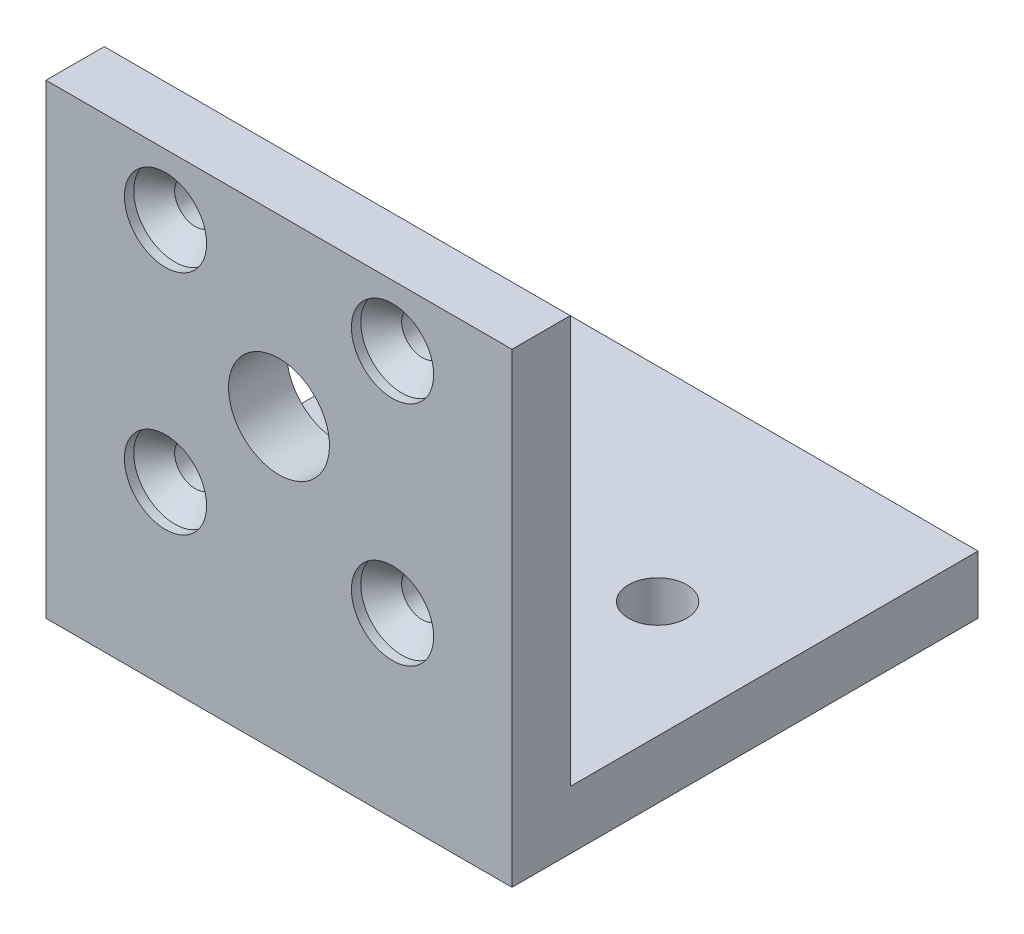
ISO-10303-21;
HEADER;
FILE_DESCRIPTION(('STEP AP214'),'2;1');
FILE_NAME('part.step','',(''),(''),'','','');
FILE_SCHEMA(('AUTOMOTIVE_DESIGN { 1 0 10303 214 1 1 1 1 }'));
ENDSEC;
DATA;
#1=APPLICATION_CONTEXT('core data for automotive mechanical design processes');
#2=APPLICATION_PROTOCOL_DEFINITION('international standard','automotive_design',2000,#1);
#3=PRODUCT_CONTEXT('',#1,'mechanical');
#4=PRODUCT('Part','Part','',(#3));
#5=PRODUCT_RELATED_PRODUCT_CATEGORY('part','',(#4));
#6=PRODUCT_DEFINITION_FORMATION('','',#4);
#7=PRODUCT_DEFINITION_CONTEXT('part definition',#1,'design');
#8=PRODUCT_DEFINITION('design','',#6,#7);
#9=PRODUCT_DEFINITION_SHAPE('','',#8);
#10=(LENGTH_UNIT() NAMED_UNIT(*) SI_UNIT(.MILLI.,.METRE.));
#11=(NAMED_UNIT(*) PLANE_ANGLE_UNIT() SI_UNIT($,.RADIAN.));
#12=(NAMED_UNIT(*) SI_UNIT($,.STERADIAN.) SOLID_ANGLE_UNIT());
#13=UNCERTAINTY_MEASURE_WITH_UNIT(LENGTH_MEASURE(1.E-05),#10,'distance_accuracy_value','');
#14=(GEOMETRIC_REPRESENTATION_CONTEXT(3) GLOBAL_UNCERTAINTY_ASSIGNED_CONTEXT((#13)) GLOBAL_UNIT_ASSIGNED_CONTEXT((#10,
#11,#12)) REPRESENTATION_CONTEXT('',''));
#15=CARTESIAN_POINT('',(0.,0.,0.));
#16=DIRECTION('',(0.,0.,1.));
#17=DIRECTION('',(1.,0.,0.));
#18=AXIS2_PLACEMENT_3D('',#15,#16,#17);
#19=CARTESIAN_POINT('',(50.8,0.,6.35));
#20=DIRECTION('',(0.,-1.,0.));
#21=DIRECTION('',(0.,0.,-1.));
#22=AXIS2_PLACEMENT_3D('',#19,#20,#21);
#23=PLANE('',#22);
#24=DIRECTION('',(0.,0.,1.));
#25=VECTOR('',#24,1.);
#26=CARTESIAN_POINT('',(0.,0.,6.35));
#27=LINE('',#26,#25);
#28=CARTESIAN_POINT('',(0.,0.,0.));
#29=VERTEX_POINT('',#28);
#30=CARTESIAN_POINT('',(0.,0.,6.35));
#31=VERTEX_POINT('',#30);
#32=EDGE_CURVE('E119',#29,#31,#27,.T.);
#33=ORIENTED_EDGE('',*,*,#32,.T.);
#34=DIRECTION('',(-1.,0.,0.));
#35=VECTOR('',#34,1.);
#36=CARTESIAN_POINT('',(50.8,0.,6.35));
#37=LINE('',#36,#35);
#38=CARTESIAN_POINT('',(50.8,0.,6.35));
#39=VERTEX_POINT('',#38);
#40=EDGE_CURVE('E11',#39,#31,#37,.T.);
#41=ORIENTED_EDGE('',*,*,#40,.F.);
#42=DIRECTION('',(0.,0.,1.));
#43=VECTOR('',#42,1.);
#44=CARTESIAN_POINT('',(50.8,0.,6.35));
#45=LINE('',#44,#43);
#46=CARTESIAN_POINT('',(50.8,0.,0.));
#47=VERTEX_POINT('',#46);
#48=EDGE_CURVE('E130',#47,#39,#45,.T.);
#49=ORIENTED_EDGE('',*,*,#48,.F.);
#50=DIRECTION('',(-1.,0.,0.));
#51=VECTOR('',#50,1.);
#52=CARTESIAN_POINT('',(50.8,0.,0.));
#53=LINE('',#52,#51);
#54=EDGE_CURVE('E115',#47,#29,#53,.T.);
#55=ORIENTED_EDGE('',*,*,#54,.T.);
#56=EDGE_LOOP('',(#33,#41,#49,#55));
#57=FACE_BOUND('',#56,.T.);
#58=ADVANCED_FACE('F33',(#57),#23,.F.);
#59=CARTESIAN_POINT('',(50.8,0.,6.35));
#60=DIRECTION('',(0.,0.,-1.));
#61=DIRECTION('',(0.,1.,0.));
#62=AXIS2_PLACEMENT_3D('',#59,#60,#61);
#63=PLANE('',#62);
#64=CARTESIAN_POINT('',(13.0256313292355,-6.67563132923533,6.35));
#65=DIRECTION('',(0.,0.,1.));
#66=DIRECTION('',(1.,0.,0.));
#67=AXIS2_PLACEMENT_3D('',#64,#65,#66);
#68=CIRCLE('',#67,4.48);
#69=CARTESIAN_POINT('',(17.5056313292355,-6.67563132923533,6.35));
#70=VERTEX_POINT('',#69);
#71=EDGE_CURVE('E427',#70,#70,#68,.T.);
#72=ORIENTED_EDGE('',*,*,#71,.F.);
#73=EDGE_LOOP('',(#72));
#74=FACE_BOUND('',#73,.T.);
#75=CARTESIAN_POINT('',(37.7743686707647,-6.6756313292355,6.35));
#76=DIRECTION('',(0.,0.,1.));
#77=DIRECTION('',(1.,0.,0.));
#78=AXIS2_PLACEMENT_3D('',#75,#76,#77);
#79=CIRCLE('',#78,4.48);
#80=CARTESIAN_POINT('',(42.2543686707647,-6.6756313292355,6.35));
#81=VERTEX_POINT('',#80);
#82=EDGE_CURVE('E154',#81,#81,#79,.T.);
#83=ORIENTED_EDGE('',*,*,#82,.F.);
#84=EDGE_LOOP('',(#83));
#85=FACE_BOUND('',#84,.T.);
#86=CARTESIAN_POINT('',(37.7743686707645,-31.4243686707647,6.35));
#87=DIRECTION('',(0.,0.,1.));
#88=DIRECTION('',(1.,0.,0.));
#89=AXIS2_PLACEMENT_3D('',#86,#87,#88);
#90=CIRCLE('',#89,4.48);
#91=CARTESIAN_POINT('',(42.2543686707645,-31.4243686707647,6.35));
#92=VERTEX_POINT('',#91);
#93=EDGE_CURVE('E147',#92,#92,#90,.T.);
#94=ORIENTED_EDGE('',*,*,#93,.F.);
#95=EDGE_LOOP('',(#94));
#96=FACE_BOUND('',#95,.T.);
#97=CARTESIAN_POINT('',(13.0256313292353,-31.4243686707645,6.35));
#98=DIRECTION('',(0.,0.,1.));
#99=DIRECTION('',(1.,0.,0.));
#100=AXIS2_PLACEMENT_3D('',#97,#98,#99);
#101=CIRCLE('',#100,4.48);
#102=CARTESIAN_POINT('',(17.5056313292353,-31.4243686707645,6.35));
#103=VERTEX_POINT('',#102);
#104=EDGE_CURVE('E143',#103,#103,#101,.T.);
#105=ORIENTED_EDGE('',*,*,#104,.F.);
#106=EDGE_LOOP('',(#105));
#107=FACE_BOUND('',#106,.T.);
#108=CARTESIAN_POINT('',(25.4,-19.05,6.35));
#109=DIRECTION('',(0.,0.,-1.));
#110=DIRECTION('',(0.,1.,0.));
#111=AXIS2_PLACEMENT_3D('',#108,#109,#110);
#112=CIRCLE('',#111,5.5);
#113=CARTESIAN_POINT('',(25.4,-13.55,6.35));
#114=VERTEX_POINT('',#113);
#115=EDGE_CURVE('E182',#114,#114,#112,.F.);
#116=ORIENTED_EDGE('',*,*,#115,.F.);
#117=EDGE_LOOP('',(#116));
#118=FACE_BOUND('',#117,.T.);
#119=DIRECTION('',(0.,-1.,0.));
#120=VECTOR('',#119,1.);
#121=CARTESIAN_POINT('',(0.,0.,6.35));
#122=LINE('',#121,#120);
#123=CARTESIAN_POINT('',(0.,-50.8,6.34999999999999));
#124=VERTEX_POINT('',#123);
#125=EDGE_CURVE('E122',#31,#124,#122,.T.);
#126=ORIENTED_EDGE('',*,*,#125,.T.);
#127=DIRECTION('',(-1.,0.,0.));
#128=VECTOR('',#127,1.);
#129=CARTESIAN_POINT('',(50.8,-50.8,6.34999999999999));
#130=LINE('',#129,#128);
#131=CARTESIAN_POINT('',(50.8,-50.8,6.34999999999999));
#132=VERTEX_POINT('',#131);
#133=EDGE_CURVE('E42',#132,#124,#130,.T.);
#134=ORIENTED_EDGE('',*,*,#133,.F.);
#135=DIRECTION('',(0.,-1.,0.));
#136=VECTOR('',#135,1.);
#137=CARTESIAN_POINT('',(50.8,0.,6.35));
#138=LINE('',#137,#136);
#139=EDGE_CURVE('E88',#39,#132,#138,.T.);
#140=ORIENTED_EDGE('',*,*,#139,.F.);
#141=ORIENTED_EDGE('',*,*,#40,.T.);
#142=EDGE_LOOP('',(#126,#134,#140,#141));
#143=FACE_BOUND('',#142,.T.);
#144=ADVANCED_FACE('F199',(#74,#85,#96,#107,#118,#143),#63,.F.);
#145=CARTESIAN_POINT('',(50.8,-50.8,6.34999999999999));
#146=DIRECTION('',(0.,1.,0.));
#147=DIRECTION('',(0.,0.,1.));
#148=AXIS2_PLACEMENT_3D('',#145,#146,#147);
#149=PLANE('',#148);
#150=CARTESIAN_POINT('',(38.1,-50.8,-22.225));
#151=DIRECTION('',(0.,1.,0.));
#152=DIRECTION('',(0.,0.,1.));
#153=AXIS2_PLACEMENT_3D('',#150,#151,#152);
#154=CIRCLE('',#153,3.175);
#155=CARTESIAN_POINT('',(38.1,-50.8,-19.05));
#156=VERTEX_POINT('',#155);
#157=EDGE_CURVE('E170',#156,#156,#154,.F.);
#158=ORIENTED_EDGE('',*,*,#157,.F.);
#159=EDGE_LOOP('',(#158));
#160=FACE_BOUND('',#159,.T.);
#161=CARTESIAN_POINT('',(12.7,-50.8,-22.225));
#162=DIRECTION('',(0.,1.,0.));
#163=DIRECTION('',(0.,0.,1.));
#164=AXIS2_PLACEMENT_3D('',#161,#162,#163);
#165=CIRCLE('',#164,3.175);
#166=CARTESIAN_POINT('',(12.7,-50.8,-19.05));
#167=VERTEX_POINT('',#166);
#168=EDGE_CURVE('E176',#167,#167,#165,.F.);
#169=ORIENTED_EDGE('',*,*,#168,.F.);
#170=EDGE_LOOP('',(#169));
#171=FACE_BOUND('',#170,.T.);
#172=DIRECTION('',(0.,0.,-1.));
#173=VECTOR('',#172,1.);
#174=CARTESIAN_POINT('',(0.,-50.8,6.34999999999999));
#175=LINE('',#174,#173);
#176=CARTESIAN_POINT('',(0.,-50.8,-44.45));
#177=VERTEX_POINT('',#176);
#178=EDGE_CURVE('E125',#124,#177,#175,.T.);
#179=ORIENTED_EDGE('',*,*,#178,.T.);
#180=DIRECTION('',(-1.,0.,0.));
#181=VECTOR('',#180,1.);
#182=CARTESIAN_POINT('',(50.8,-50.8,-44.45));
#183=LINE('',#182,#181);
#184=CARTESIAN_POINT('',(50.8,-50.8,-44.45));
#185=VERTEX_POINT('',#184);
#186=EDGE_CURVE('E110',#185,#177,#183,.T.);
#187=ORIENTED_EDGE('',*,*,#186,.F.);
#188=DIRECTION('',(0.,0.,-1.));
#189=VECTOR('',#188,1.);
#190=CARTESIAN_POINT('',(50.8,-50.8,6.34999999999999));
#191=LINE('',#190,#189);
#192=EDGE_CURVE('E101',#132,#185,#191,.T.);
#193=ORIENTED_EDGE('',*,*,#192,.F.);
#194=ORIENTED_EDGE('',*,*,#133,.T.);
#195=EDGE_LOOP('',(#179,#187,#193,#194));
#196=FACE_BOUND('',#195,.T.);
#197=ADVANCED_FACE('F202',(#160,#171,#196),#149,.F.);
#198=CARTESIAN_POINT('',(50.8,-44.45,-44.45));
#199=DIRECTION('',(0.,0.,1.));
#200=DIRECTION('',(1.,0.,0.));
#201=AXIS2_PLACEMENT_3D('',#198,#199,#200);
#202=PLANE('',#201);
#203=DIRECTION('',(0.,1.,0.));
#204=VECTOR('',#203,1.);
#205=CARTESIAN_POINT('',(0.,-44.45,-44.45));
#206=LINE('',#205,#204);
#207=CARTESIAN_POINT('',(0.,-44.45,-44.45));
#208=VERTEX_POINT('',#207);
#209=EDGE_CURVE('E109',#177,#208,#206,.T.);
#210=ORIENTED_EDGE('',*,*,#209,.T.);
#211=DIRECTION('',(-1.,0.,0.));
#212=VECTOR('',#211,1.);
#213=CARTESIAN_POINT('',(50.8,-44.45,-44.45));
#214=LINE('',#213,#212);
#215=CARTESIAN_POINT('',(50.8,-44.45,-44.45));
#216=VERTEX_POINT('',#215);
#217=EDGE_CURVE('E106',#216,#208,#214,.T.);
#218=ORIENTED_EDGE('',*,*,#217,.F.);
#219=DIRECTION('',(0.,1.,0.));
#220=VECTOR('',#219,1.);
#221=CARTESIAN_POINT('',(50.8,-44.45,-44.45));
#222=LINE('',#221,#220);
#223=EDGE_CURVE('E95',#185,#216,#222,.T.);
#224=ORIENTED_EDGE('',*,*,#223,.F.);
#225=ORIENTED_EDGE('',*,*,#186,.T.);
#226=EDGE_LOOP('',(#210,#218,#224,#225));
#227=FACE_BOUND('',#226,.T.);
#228=ADVANCED_FACE('F107',(#227),#202,.F.);
#229=CARTESIAN_POINT('',(50.8,-44.45,0.));
#230=DIRECTION('',(0.,-1.,0.));
#231=DIRECTION('',(0.,0.,-1.));
#232=AXIS2_PLACEMENT_3D('',#229,#230,#231);
#233=PLANE('',#232);
#234=CARTESIAN_POINT('',(38.1,-44.45,-22.225));
#235=DIRECTION('',(0.,1.,0.));
#236=DIRECTION('',(0.,0.,1.));
#237=AXIS2_PLACEMENT_3D('',#234,#235,#236);
#238=CIRCLE('',#237,3.175);
#239=CARTESIAN_POINT('',(38.1,-44.45,-19.05));
#240=VERTEX_POINT('',#239);
#241=EDGE_CURVE('E139',#240,#240,#238,.T.);
#242=ORIENTED_EDGE('',*,*,#241,.F.);
#243=EDGE_LOOP('',(#242));
#244=FACE_BOUND('',#243,.T.);
#245=CARTESIAN_POINT('',(12.7,-44.45,-22.225));
#246=DIRECTION('',(0.,1.,0.));
#247=DIRECTION('',(0.,0.,1.));
#248=AXIS2_PLACEMENT_3D('',#245,#246,#247);
#249=CIRCLE('',#248,3.175);
#250=CARTESIAN_POINT('',(12.7,-44.45,-19.05));
#251=VERTEX_POINT('',#250);
#252=EDGE_CURVE('E173',#251,#251,#249,.T.);
#253=ORIENTED_EDGE('',*,*,#252,.F.);
#254=EDGE_LOOP('',(#253));
#255=FACE_BOUND('',#254,.T.);
#256=DIRECTION('',(0.,0.,1.));
#257=VECTOR('',#256,1.);
#258=CARTESIAN_POINT('',(0.,-44.45,0.));
#259=LINE('',#258,#257);
#260=CARTESIAN_POINT('',(0.,-44.45,0.));
#261=VERTEX_POINT('',#260);
#262=EDGE_CURVE('E74',#208,#261,#259,.T.);
#263=ORIENTED_EDGE('',*,*,#262,.T.);
#264=DIRECTION('',(-1.,0.,0.));
#265=VECTOR('',#264,1.);
#266=CARTESIAN_POINT('',(50.8,-44.45,0.));
#267=LINE('',#266,#265);
#268=CARTESIAN_POINT('',(50.8,-44.45,0.));
#269=VERTEX_POINT('',#268);
#270=EDGE_CURVE('E111',#269,#261,#267,.T.);
#271=ORIENTED_EDGE('',*,*,#270,.F.);
#272=DIRECTION('',(0.,0.,1.));
#273=VECTOR('',#272,1.);
#274=CARTESIAN_POINT('',(50.8,-44.45,0.));
#275=LINE('',#274,#273);
#276=EDGE_CURVE('E99',#216,#269,#275,.T.);
#277=ORIENTED_EDGE('',*,*,#276,.F.);
#278=ORIENTED_EDGE('',*,*,#217,.T.);
#279=EDGE_LOOP('',(#263,#271,#277,#278));
#280=FACE_BOUND('',#279,.T.);
#281=ADVANCED_FACE('F113',(#244,#255,#280),#233,.F.);
#282=CARTESIAN_POINT('',(50.8,0.,0.));
#283=DIRECTION('',(0.,0.,1.));
#284=DIRECTION('',(0.,-1.,0.));
#285=AXIS2_PLACEMENT_3D('',#282,#283,#284);
#286=PLANE('',#285);
#287=CARTESIAN_POINT('',(25.4,-19.05,0.));
#288=DIRECTION('',(0.,0.,-1.));
#289=DIRECTION('',(0.,1.,0.));
#290=AXIS2_PLACEMENT_3D('',#287,#288,#289);
#291=CIRCLE('',#290,5.5);
#292=CARTESIAN_POINT('',(25.4,-13.55,0.));
#293=VERTEX_POINT('',#292);
#294=EDGE_CURVE('E179',#293,#293,#291,.T.);
#295=ORIENTED_EDGE('',*,*,#294,.F.);
#296=EDGE_LOOP('',(#295));
#297=FACE_BOUND('',#296,.T.);
#298=CARTESIAN_POINT('',(37.7743686707647,-6.6756313292355,0.));
#299=DIRECTION('',(0.,0.,-1.));
#300=DIRECTION('',(0.,1.,0.));
#301=AXIS2_PLACEMENT_3D('',#298,#299,#300);
#302=CIRCLE('',#301,2.25);
#303=CARTESIAN_POINT('',(37.7743686707647,-4.4256313292355,0.));
#304=VERTEX_POINT('',#303);
#305=EDGE_CURVE('E185',#304,#304,#302,.T.);
#306=ORIENTED_EDGE('',*,*,#305,.F.);
#307=EDGE_LOOP('',(#306));
#308=FACE_BOUND('',#307,.T.);
#309=CARTESIAN_POINT('',(37.7743686707645,-31.4243686707647,0.));
#310=DIRECTION('',(0.,0.,-1.));
#311=DIRECTION('',(0.,1.,0.));
#312=AXIS2_PLACEMENT_3D('',#309,#310,#311);
#313=CIRCLE('',#312,2.25);
#314=CARTESIAN_POINT('',(37.7743686707645,-29.1743686707647,0.));
#315=VERTEX_POINT('',#314);
#316=EDGE_CURVE('E188',#315,#315,#313,.T.);
#317=ORIENTED_EDGE('',*,*,#316,.F.);
#318=EDGE_LOOP('',(#317));
#319=FACE_BOUND('',#318,.T.);
#320=CARTESIAN_POINT('',(13.0256313292353,-31.4243686707645,0.));
#321=DIRECTION('',(0.,0.,-1.));
#322=DIRECTION('',(0.,1.,0.));
#323=AXIS2_PLACEMENT_3D('',#320,#321,#322);
#324=CIRCLE('',#323,2.25);
#325=CARTESIAN_POINT('',(13.0256313292353,-29.1743686707645,0.));
#326=VERTEX_POINT('',#325);
#327=EDGE_CURVE('E191',#326,#326,#324,.T.);
#328=ORIENTED_EDGE('',*,*,#327,.F.);
#329=EDGE_LOOP('',(#328));
#330=FACE_BOUND('',#329,.T.);
#331=CARTESIAN_POINT('',(13.0256313292355,-6.67563132923532,0.));
#332=DIRECTION('',(0.,0.,-1.));
#333=DIRECTION('',(0.,1.,0.));
#334=AXIS2_PLACEMENT_3D('',#331,#332,#333);
#335=CIRCLE('',#334,2.25);
#336=CARTESIAN_POINT('',(13.0256313292355,-4.42563132923532,0.));
#337=VERTEX_POINT('',#336);
#338=EDGE_CURVE('E123',#337,#337,#335,.T.);
#339=ORIENTED_EDGE('',*,*,#338,.F.);
#340=EDGE_LOOP('',(#339));
#341=FACE_BOUND('',#340,.T.);
#342=DIRECTION('',(0.,1.,0.));
#343=VECTOR('',#342,1.);
#344=CARTESIAN_POINT('',(0.,0.,0.));
#345=LINE('',#344,#343);
#346=EDGE_CURVE('E80',#261,#29,#345,.T.);
#347=ORIENTED_EDGE('',*,*,#346,.T.);
#348=ORIENTED_EDGE('',*,*,#54,.F.);
#349=DIRECTION('',(0.,1.,0.));
#350=VECTOR('',#349,1.);
#351=CARTESIAN_POINT('',(50.8,0.,0.));
#352=LINE('',#351,#350);
#353=EDGE_CURVE('E51',#269,#47,#352,.T.);
#354=ORIENTED_EDGE('',*,*,#353,.F.);
#355=ORIENTED_EDGE('',*,*,#270,.T.);
#356=EDGE_LOOP('',(#347,#348,#354,#355));
#357=FACE_BOUND('',#356,.T.);
#358=ADVANCED_FACE('F207',(#297,#308,#319,#330,#341,#357),#286,.F.);
#359=CARTESIAN_POINT('',(50.8,0.,0.));
#360=DIRECTION('',(-1.,0.,0.));
#361=DIRECTION('',(0.,0.,1.));
#362=AXIS2_PLACEMENT_3D('',#359,#360,#361);
#363=PLANE('',#362);
#364=ORIENTED_EDGE('',*,*,#48,.T.);
#365=ORIENTED_EDGE('',*,*,#139,.T.);
#366=ORIENTED_EDGE('',*,*,#192,.T.);
#367=ORIENTED_EDGE('',*,*,#223,.T.);
#368=ORIENTED_EDGE('',*,*,#276,.T.);
#369=ORIENTED_EDGE('',*,*,#353,.T.);
#370=EDGE_LOOP('',(#364,#365,#366,#367,#368,#369));
#371=FACE_BOUND('',#370,.T.);
#372=ADVANCED_FACE('F97',(#371),#363,.F.);
#373=CARTESIAN_POINT('',(0.,0.,0.));
#374=DIRECTION('',(-1.,0.,0.));
#375=DIRECTION('',(0.,0.,1.));
#376=AXIS2_PLACEMENT_3D('',#373,#374,#375);
#377=PLANE('',#376);
#378=ORIENTED_EDGE('',*,*,#32,.F.);
#379=ORIENTED_EDGE('',*,*,#346,.F.);
#380=ORIENTED_EDGE('',*,*,#262,.F.);
#381=ORIENTED_EDGE('',*,*,#209,.F.);
#382=ORIENTED_EDGE('',*,*,#178,.F.);
#383=ORIENTED_EDGE('',*,*,#125,.F.);
#384=EDGE_LOOP('',(#378,#379,#380,#381,#382,#383));
#385=FACE_BOUND('',#384,.T.);
#386=ADVANCED_FACE('F205',(#385),#377,.T.);
#387=CARTESIAN_POINT('',(13.0256313292355,-6.67563132923533,6.35100000000001));
#388=DIRECTION('',(0.,0.,-1.));
#389=DIRECTION('',(0.,1.,0.));
#390=AXIS2_PLACEMENT_3D('',#387,#388,#389);
#391=CYLINDRICAL_SURFACE('',#390,2.25);
#392=CARTESIAN_POINT('',(13.0256313292355,-6.67563132923533,3.10399999999999));
#393=DIRECTION('',(0.,0.,1.));
#394=DIRECTION('',(1.,0.,0.));
#395=AXIS2_PLACEMENT_3D('',#392,#393,#394);
#396=CIRCLE('',#395,2.25);
#397=CARTESIAN_POINT('',(15.2756313292355,-6.67563132923533,3.10399999999999));
#398=VERTEX_POINT('',#397);
#399=EDGE_CURVE('E36',#398,#398,#396,.T.);
#400=ORIENTED_EDGE('',*,*,#399,.T.);
#401=EDGE_LOOP('',(#400));
#402=FACE_BOUND('',#401,.T.);
#403=ORIENTED_EDGE('',*,*,#338,.T.);
#404=EDGE_LOOP('',(#403));
#405=FACE_BOUND('',#404,.T.);
#406=ADVANCED_FACE('F284',(#402,#405),#391,.F.);
#407=CARTESIAN_POINT('',(13.0256313292353,-31.4243686707645,6.351));
#408=DIRECTION('',(0.,0.,-1.));
#409=DIRECTION('',(0.,1.,0.));
#410=AXIS2_PLACEMENT_3D('',#407,#408,#409);
#411=CYLINDRICAL_SURFACE('',#410,2.25);
#412=CARTESIAN_POINT('',(13.0256313292353,-31.4243686707645,3.104));
#413=DIRECTION('',(0.,0.,1.));
#414=DIRECTION('',(1.,0.,0.));
#415=AXIS2_PLACEMENT_3D('',#412,#413,#414);
#416=CIRCLE('',#415,2.25);
#417=CARTESIAN_POINT('',(15.2756313292353,-31.4243686707645,3.104));
#418=VERTEX_POINT('',#417);
#419=EDGE_CURVE('E136',#418,#418,#416,.T.);
#420=ORIENTED_EDGE('',*,*,#419,.T.);
#421=EDGE_LOOP('',(#420));
#422=FACE_BOUND('',#421,.T.);
#423=ORIENTED_EDGE('',*,*,#327,.T.);
#424=EDGE_LOOP('',(#423));
#425=FACE_BOUND('',#424,.T.);
#426=ADVANCED_FACE('F289',(#422,#425),#411,.F.);
#427=CARTESIAN_POINT('',(37.7743686707645,-31.4243686707647,6.351));
#428=DIRECTION('',(0.,0.,-1.));
#429=DIRECTION('',(0.,1.,0.));
#430=AXIS2_PLACEMENT_3D('',#427,#428,#429);
#431=CYLINDRICAL_SURFACE('',#430,2.25);
#432=CARTESIAN_POINT('',(37.7743686707645,-31.4243686707647,3.104));
#433=DIRECTION('',(0.,0.,1.));
#434=DIRECTION('',(1.,0.,0.));
#435=AXIS2_PLACEMENT_3D('',#432,#433,#434);
#436=CIRCLE('',#435,2.25);
#437=CARTESIAN_POINT('',(40.0243686707645,-31.4243686707647,3.104));
#438=VERTEX_POINT('',#437);
#439=EDGE_CURVE('E141',#438,#438,#436,.T.);
#440=ORIENTED_EDGE('',*,*,#439,.T.);
#441=EDGE_LOOP('',(#440));
#442=FACE_BOUND('',#441,.T.);
#443=ORIENTED_EDGE('',*,*,#316,.T.);
#444=EDGE_LOOP('',(#443));
#445=FACE_BOUND('',#444,.T.);
#446=ADVANCED_FACE('F301',(#442,#445),#431,.F.);
#447=CARTESIAN_POINT('',(37.7743686707647,-6.6756313292355,6.35100000000001));
#448=DIRECTION('',(0.,0.,-1.));
#449=DIRECTION('',(0.,1.,0.));
#450=AXIS2_PLACEMENT_3D('',#447,#448,#449);
#451=CYLINDRICAL_SURFACE('',#450,2.25);
#452=CARTESIAN_POINT('',(37.7743686707647,-6.6756313292355,3.10399999999999));
#453=DIRECTION('',(0.,0.,1.));
#454=DIRECTION('',(1.,0.,0.));
#455=AXIS2_PLACEMENT_3D('',#452,#453,#454);
#456=CIRCLE('',#455,2.25);
#457=CARTESIAN_POINT('',(40.0243686707647,-6.6756313292355,3.10399999999999));
#458=VERTEX_POINT('',#457);
#459=EDGE_CURVE('E145',#458,#458,#456,.T.);
#460=ORIENTED_EDGE('',*,*,#459,.T.);
#461=EDGE_LOOP('',(#460));
#462=FACE_BOUND('',#461,.T.);
#463=ORIENTED_EDGE('',*,*,#305,.T.);
#464=EDGE_LOOP('',(#463));
#465=FACE_BOUND('',#464,.T.);
#466=ADVANCED_FACE('F311',(#462,#465),#451,.F.);
#467=CARTESIAN_POINT('',(25.4,-19.05,6.351));
#468=DIRECTION('',(0.,0.,-1.));
#469=DIRECTION('',(0.,1.,0.));
#470=AXIS2_PLACEMENT_3D('',#467,#468,#469);
#471=CYLINDRICAL_SURFACE('',#470,5.5);
#472=ORIENTED_EDGE('',*,*,#294,.T.);
#473=EDGE_LOOP('',(#472));
#474=FACE_BOUND('',#473,.T.);
#475=ORIENTED_EDGE('',*,*,#115,.T.);
#476=EDGE_LOOP('',(#475));
#477=FACE_BOUND('',#476,.T.);
#478=ADVANCED_FACE('F259',(#474,#477),#471,.F.);
#479=CARTESIAN_POINT('',(12.7,-50.801,-22.225));
#480=DIRECTION('',(0.,1.,0.));
#481=DIRECTION('',(0.,0.,1.));
#482=AXIS2_PLACEMENT_3D('',#479,#480,#481);
#483=CYLINDRICAL_SURFACE('',#482,3.175);
#484=CARTESIAN_POINT('',(12.7,-44.45,-19.05));
#485=CARTESIAN_POINT('',(12.7,-44.5161458333333,-19.05));
#486=CARTESIAN_POINT('',(12.7,-44.5822916666667,-19.05));
#487=CARTESIAN_POINT('',(12.7,-44.7145833333333,-19.05));
#488=CARTESIAN_POINT('',(12.7,-44.7807291666667,-19.05));
#489=CARTESIAN_POINT('',(12.7,-44.9130208333333,-19.05));
#490=CARTESIAN_POINT('',(12.7,-44.9791666666667,-19.05));
#491=CARTESIAN_POINT('',(12.7,-45.1114583333333,-19.05));
#492=CARTESIAN_POINT('',(12.7,-45.1776041666667,-19.05));
#493=CARTESIAN_POINT('',(12.7,-45.3098958333333,-19.05));
#494=CARTESIAN_POINT('',(12.7,-45.3760416666667,-19.05));
#495=CARTESIAN_POINT('',(12.7,-45.5083333333333,-19.05));
#496=CARTESIAN_POINT('',(12.7,-45.5744791666667,-19.05));
#497=CARTESIAN_POINT('',(12.7,-45.7067708333333,-19.05));
#498=CARTESIAN_POINT('',(12.7,-45.7729166666667,-19.05));
#499=CARTESIAN_POINT('',(12.7,-45.9052083333333,-19.05));
#500=CARTESIAN_POINT('',(12.7,-45.9713541666667,-19.05));
#501=CARTESIAN_POINT('',(12.7,-46.1036458333333,-19.05));
#502=CARTESIAN_POINT('',(12.7,-46.1697916666667,-19.05));
#503=CARTESIAN_POINT('',(12.7,-46.3020833333333,-19.05));
#504=CARTESIAN_POINT('',(12.7,-46.3682291666667,-19.05));
#505=CARTESIAN_POINT('',(12.7,-46.5005208333333,-19.05));
#506=CARTESIAN_POINT('',(12.7,-46.5666666666667,-19.05));
#507=CARTESIAN_POINT('',(12.7,-46.6989583333333,-19.05));
#508=CARTESIAN_POINT('',(12.7,-46.7651041666667,-19.05));
#509=CARTESIAN_POINT('',(12.7,-46.8973958333333,-19.05));
#510=CARTESIAN_POINT('',(12.7,-46.9635416666667,-19.05));
#511=CARTESIAN_POINT('',(12.7,-47.0958333333333,-19.05));
#512=CARTESIAN_POINT('',(12.7,-47.1619791666667,-19.05));
#513=CARTESIAN_POINT('',(12.7,-47.2942708333333,-19.05));
#514=CARTESIAN_POINT('',(12.7,-47.3604166666667,-19.05));
#515=CARTESIAN_POINT('',(12.7,-47.4927083333333,-19.05));
#516=CARTESIAN_POINT('',(12.7,-47.5588541666667,-19.05));
#517=CARTESIAN_POINT('',(12.7,-47.6911458333333,-19.05));
#518=CARTESIAN_POINT('',(12.7,-47.7572916666667,-19.05));
#519=CARTESIAN_POINT('',(12.7,-47.8895833333333,-19.05));
#520=CARTESIAN_POINT('',(12.7,-47.9557291666667,-19.05));
#521=CARTESIAN_POINT('',(12.7,-48.0880208333333,-19.05));
#522=CARTESIAN_POINT('',(12.7,-48.1541666666667,-19.05));
#523=CARTESIAN_POINT('',(12.7,-48.2864583333333,-19.05));
#524=CARTESIAN_POINT('',(12.7,-48.3526041666667,-19.05));
#525=CARTESIAN_POINT('',(12.7,-48.4848958333333,-19.05));
#526=CARTESIAN_POINT('',(12.7,-48.5510416666667,-19.05));
#527=CARTESIAN_POINT('',(12.7,-48.6833333333333,-19.05));
#528=CARTESIAN_POINT('',(12.7,-48.7494791666667,-19.05));
#529=CARTESIAN_POINT('',(12.7,-48.8817708333333,-19.05));
#530=CARTESIAN_POINT('',(12.7,-48.9479166666667,-19.05));
#531=CARTESIAN_POINT('',(12.7,-49.0802083333333,-19.05));
#532=CARTESIAN_POINT('',(12.7,-49.1463541666667,-19.05));
#533=CARTESIAN_POINT('',(12.7,-49.2786458333333,-19.05));
#534=CARTESIAN_POINT('',(12.7,-49.3447916666667,-19.05));
#535=CARTESIAN_POINT('',(12.7,-49.4770833333333,-19.05));
#536=CARTESIAN_POINT('',(12.7,-49.5432291666667,-19.05));
#537=CARTESIAN_POINT('',(12.7,-49.6755208333333,-19.05));
#538=CARTESIAN_POINT('',(12.7,-49.7416666666667,-19.05));
#539=CARTESIAN_POINT('',(12.7,-49.8739583333333,-19.05));
#540=CARTESIAN_POINT('',(12.7,-49.9401041666667,-19.05));
#541=CARTESIAN_POINT('',(12.7,-50.0723958333333,-19.05));
#542=CARTESIAN_POINT('',(12.7,-50.1385416666667,-19.05));
#543=CARTESIAN_POINT('',(12.7,-50.2708333333333,-19.05));
#544=CARTESIAN_POINT('',(12.7,-50.3369791666667,-19.05));
#545=CARTESIAN_POINT('',(12.7,-50.4692708333333,-19.05));
#546=CARTESIAN_POINT('',(12.7,-50.5354166666667,-19.05));
#547=CARTESIAN_POINT('',(12.7,-50.6677083333333,-19.05));
#548=CARTESIAN_POINT('',(12.7,-50.7338541666667,-19.05));
#549=CARTESIAN_POINT('',(12.7,-50.8,-19.05));
#550=B_SPLINE_CURVE_WITH_KNOTS('',3,(#484,#485,#486,#487,#488,#489,#490,#491,#492,#493,#494,
#495,#496,#497,#498,#499,#500,#501,#502,#503,#504,#505,#506,#507,#508,#509,#510,#511,#512,#513,
#514,#515,#516,#517,#518,#519,#520,#521,#522,#523,#524,#525,#526,#527,#528,#529,#530,#531,#532,
#533,#534,#535,#536,#537,#538,#539,#540,#541,#542,#543,#544,#545,#546,#547,#548,#549),
.UNSPECIFIED.,.F.,.F.,(4,2,2,2,2,2,2,2,2,2,2,2,2,2,2,2,2,2,2,2,2,2,2,2,2,2,2,2,2,2,2,2,4),(0.,
0.198437500000002,0.396875000000005,0.5953125,0.793750000000003,0.992187500000005,1.190625,
1.3890625,1.58750000000001,1.7859375,1.984375,2.18281250000001,2.38125,2.5796875,
2.77812500000001,2.9765625,3.175,3.37343750000001,3.571875,3.7703125,3.96875000000001,4.1671875,
4.365625,4.56406250000001,4.7625,4.96093750000001,5.15937500000001,5.3578125,5.55625000000001,
5.75468750000001,5.953125,6.15156250000001,6.35000000000001),.UNSPECIFIED.);
#551=EDGE_CURVE('BSEAM253',#251,#167,#550,.T.);
#552=ORIENTED_EDGE('',*,*,#252,.T.);
#553=ORIENTED_EDGE('',*,*,#168,.T.);
#554=ORIENTED_EDGE('',*,*,#551,.T.);
#555=ORIENTED_EDGE('',*,*,#551,.F.);
#556=EDGE_LOOP('',(#552,#554,#553,#555));
#557=FACE_BOUND('',#556,.T.);
#558=ADVANCED_FACE('F253',(#557),#483,.F.);
#559=CARTESIAN_POINT('',(38.1,-50.801,-22.225));
#560=DIRECTION('',(0.,1.,0.));
#561=DIRECTION('',(0.,0.,1.));
#562=AXIS2_PLACEMENT_3D('',#559,#560,#561);
#563=CYLINDRICAL_SURFACE('',#562,3.175);
#564=CARTESIAN_POINT('',(38.1,-44.45,-19.05));
#565=CARTESIAN_POINT('',(38.1,-44.5161458333333,-19.05));
#566=CARTESIAN_POINT('',(38.1,-44.5822916666667,-19.05));
#567=CARTESIAN_POINT('',(38.1,-44.7145833333333,-19.05));
#568=CARTESIAN_POINT('',(38.1,-44.7807291666667,-19.05));
#569=CARTESIAN_POINT('',(38.1,-44.9130208333333,-19.05));
#570=CARTESIAN_POINT('',(38.1,-44.9791666666667,-19.05));
#571=CARTESIAN_POINT('',(38.1,-45.1114583333333,-19.05));
#572=CARTESIAN_POINT('',(38.1,-45.1776041666667,-19.05));
#573=CARTESIAN_POINT('',(38.1,-45.3098958333333,-19.05));
#574=CARTESIAN_POINT('',(38.1,-45.3760416666667,-19.05));
#575=CARTESIAN_POINT('',(38.1,-45.5083333333333,-19.05));
#576=CARTESIAN_POINT('',(38.1,-45.5744791666667,-19.05));
#577=CARTESIAN_POINT('',(38.1,-45.7067708333333,-19.05));
#578=CARTESIAN_POINT('',(38.1,-45.7729166666667,-19.05));
#579=CARTESIAN_POINT('',(38.1,-45.9052083333333,-19.05));
#580=CARTESIAN_POINT('',(38.1,-45.9713541666667,-19.05));
#581=CARTESIAN_POINT('',(38.1,-46.1036458333333,-19.05));
#582=CARTESIAN_POINT('',(38.1,-46.1697916666667,-19.05));
#583=CARTESIAN_POINT('',(38.1,-46.3020833333333,-19.05));
#584=CARTESIAN_POINT('',(38.1,-46.3682291666667,-19.05));
#585=CARTESIAN_POINT('',(38.1,-46.5005208333333,-19.05));
#586=CARTESIAN_POINT('',(38.1,-46.5666666666667,-19.05));
#587=CARTESIAN_POINT('',(38.1,-46.6989583333333,-19.05));
#588=CARTESIAN_POINT('',(38.1,-46.7651041666667,-19.05));
#589=CARTESIAN_POINT('',(38.1,-46.8973958333333,-19.05));
#590=CARTESIAN_POINT('',(38.1,-46.9635416666667,-19.05));
#591=CARTESIAN_POINT('',(38.1,-47.0958333333333,-19.05));
#592=CARTESIAN_POINT('',(38.1,-47.1619791666667,-19.05));
#593=CARTESIAN_POINT('',(38.1,-47.2942708333333,-19.05));
#594=CARTESIAN_POINT('',(38.1,-47.3604166666667,-19.05));
#595=CARTESIAN_POINT('',(38.1,-47.4927083333333,-19.05));
#596=CARTESIAN_POINT('',(38.1,-47.5588541666667,-19.05));
#597=CARTESIAN_POINT('',(38.1,-47.6911458333333,-19.05));
#598=CARTESIAN_POINT('',(38.1,-47.7572916666667,-19.05));
#599=CARTESIAN_POINT('',(38.1,-47.8895833333333,-19.05));
#600=CARTESIAN_POINT('',(38.1,-47.9557291666667,-19.05));
#601=CARTESIAN_POINT('',(38.1,-48.0880208333333,-19.05));
#602=CARTESIAN_POINT('',(38.1,-48.1541666666667,-19.05));
#603=CARTESIAN_POINT('',(38.1,-48.2864583333333,-19.05));
#604=CARTESIAN_POINT('',(38.1,-48.3526041666667,-19.05));
#605=CARTESIAN_POINT('',(38.1,-48.4848958333333,-19.05));
#606=CARTESIAN_POINT('',(38.1,-48.5510416666667,-19.05));
#607=CARTESIAN_POINT('',(38.1,-48.6833333333333,-19.05));
#608=CARTESIAN_POINT('',(38.1,-48.7494791666667,-19.05));
#609=CARTESIAN_POINT('',(38.1,-48.8817708333333,-19.05));
#610=CARTESIAN_POINT('',(38.1,-48.9479166666667,-19.05));
#611=CARTESIAN_POINT('',(38.1,-49.0802083333333,-19.05));
#612=CARTESIAN_POINT('',(38.1,-49.1463541666667,-19.05));
#613=CARTESIAN_POINT('',(38.1,-49.2786458333333,-19.05));
#614=CARTESIAN_POINT('',(38.1,-49.3447916666667,-19.05));
#615=CARTESIAN_POINT('',(38.1,-49.4770833333333,-19.05));
#616=CARTESIAN_POINT('',(38.1,-49.5432291666667,-19.05));
#617=CARTESIAN_POINT('',(38.1,-49.6755208333333,-19.05));
#618=CARTESIAN_POINT('',(38.1,-49.7416666666667,-19.05));
#619=CARTESIAN_POINT('',(38.1,-49.8739583333333,-19.05));
#620=CARTESIAN_POINT('',(38.1,-49.9401041666667,-19.05));
#621=CARTESIAN_POINT('',(38.1,-50.0723958333333,-19.05));
#622=CARTESIAN_POINT('',(38.1,-50.1385416666667,-19.05));
#623=CARTESIAN_POINT('',(38.1,-50.2708333333333,-19.05));
#624=CARTESIAN_POINT('',(38.1,-50.3369791666667,-19.05));
#625=CARTESIAN_POINT('',(38.1,-50.4692708333333,-19.05));
#626=CARTESIAN_POINT('',(38.1,-50.5354166666667,-19.05));
#627=CARTESIAN_POINT('',(38.1,-50.6677083333333,-19.05));
#628=CARTESIAN_POINT('',(38.1,-50.7338541666667,-19.05));
#629=CARTESIAN_POINT('',(38.1,-50.8,-19.05));
#630=B_SPLINE_CURVE_WITH_KNOTS('',3,(#564,#565,#566,#567,#568,#569,#570,#571,#572,#573,#574,
#575,#576,#577,#578,#579,#580,#581,#582,#583,#584,#585,#586,#587,#588,#589,#590,#591,#592,#593,
#594,#595,#596,#597,#598,#599,#600,#601,#602,#603,#604,#605,#606,#607,#608,#609,#610,#611,#612,
#613,#614,#615,#616,#617,#618,#619,#620,#621,#622,#623,#624,#625,#626,#627,#628,#629),
.UNSPECIFIED.,.F.,.F.,(4,2,2,2,2,2,2,2,2,2,2,2,2,2,2,2,2,2,2,2,2,2,2,2,2,2,2,2,2,2,2,2,4),(0.,
0.198437500000002,0.396875000000005,0.5953125,0.793750000000003,0.992187500000005,1.190625,
1.3890625,1.58750000000001,1.7859375,1.984375,2.18281250000001,2.38125,2.5796875,
2.77812500000001,2.9765625,3.175,3.37343750000001,3.571875,3.7703125,3.96875000000001,4.1671875,
4.365625,4.56406250000001,4.7625,4.96093750000001,5.15937500000001,5.3578125,5.55625000000001,
5.75468750000001,5.953125,6.15156250000001,6.35000000000001),.UNSPECIFIED.);
#631=EDGE_CURVE('BSEAM258',#240,#156,#630,.T.);
#632=ORIENTED_EDGE('',*,*,#241,.T.);
#633=ORIENTED_EDGE('',*,*,#157,.T.);
#634=ORIENTED_EDGE('',*,*,#631,.T.);
#635=ORIENTED_EDGE('',*,*,#631,.F.);
#636=EDGE_LOOP('',(#632,#634,#633,#635));
#637=FACE_BOUND('',#636,.T.);
#638=ADVANCED_FACE('F258',(#637),#563,.F.);
#639=CARTESIAN_POINT('',(13.0256313292353,-31.4243686707645,5.334));
#640=DIRECTION('',(0.,0.,1.));
#641=DIRECTION('',(1.,0.,0.));
#642=AXIS2_PLACEMENT_3D('',#639,#640,#641);
#643=CONICAL_SURFACE('',#642,4.48,0.785398163397447);
#644=CARTESIAN_POINT('',(13.0256313292353,-31.4243686707645,5.334));
#645=DIRECTION('',(0.,0.,1.));
#646=DIRECTION('',(1.,0.,0.));
#647=AXIS2_PLACEMENT_3D('',#644,#645,#646);
#648=CIRCLE('',#647,4.48);
#649=CARTESIAN_POINT('',(17.5056313292353,-31.4243686707645,5.334));
#650=VERTEX_POINT('',#649);
#651=EDGE_CURVE('E140',#650,#650,#648,.T.);
#652=ORIENTED_EDGE('',*,*,#651,.T.);
#653=EDGE_LOOP('',(#652));
#654=FACE_BOUND('',#653,.T.);
#655=ORIENTED_EDGE('',*,*,#419,.F.);
#656=EDGE_LOOP('',(#655));
#657=FACE_BOUND('',#656,.T.);
#658=ADVANCED_FACE('F270',(#654,#657),#643,.F.);
#659=CARTESIAN_POINT('',(13.0256313292353,-31.4243686707645,6.35));
#660=DIRECTION('',(0.,0.,1.));
#661=DIRECTION('',(1.,0.,0.));
#662=AXIS2_PLACEMENT_3D('',#659,#660,#661);
#663=CYLINDRICAL_SURFACE('',#662,4.48);
#664=ORIENTED_EDGE('',*,*,#651,.F.);
#665=EDGE_LOOP('',(#664));
#666=FACE_BOUND('',#665,.T.);
#667=ORIENTED_EDGE('',*,*,#104,.T.);
#668=EDGE_LOOP('',(#667));
#669=FACE_BOUND('',#668,.T.);
#670=ADVANCED_FACE('F327',(#666,#669),#663,.F.);
#671=CARTESIAN_POINT('',(37.7743686707645,-31.4243686707647,5.334));
#672=DIRECTION('',(0.,0.,1.));
#673=DIRECTION('',(1.,0.,0.));
#674=AXIS2_PLACEMENT_3D('',#671,#672,#673);
#675=CONICAL_SURFACE('',#674,4.48,0.785398163397446);
#676=CARTESIAN_POINT('',(37.7743686707645,-31.4243686707647,5.334));
#677=DIRECTION('',(0.,0.,1.));
#678=DIRECTION('',(1.,0.,0.));
#679=AXIS2_PLACEMENT_3D('',#676,#677,#678);
#680=CIRCLE('',#679,4.48);
#681=CARTESIAN_POINT('',(42.2543686707645,-31.4243686707647,5.334));
#682=VERTEX_POINT('',#681);
#683=EDGE_CURVE('E144',#682,#682,#680,.T.);
#684=ORIENTED_EDGE('',*,*,#683,.T.);
#685=EDGE_LOOP('',(#684));
#686=FACE_BOUND('',#685,.T.);
#687=ORIENTED_EDGE('',*,*,#439,.F.);
#688=EDGE_LOOP('',(#687));
#689=FACE_BOUND('',#688,.T.);
#690=ADVANCED_FACE('F337',(#686,#689),#675,.F.);
#691=CARTESIAN_POINT('',(37.7743686707645,-31.4243686707647,6.35));
#692=DIRECTION('',(0.,0.,1.));
#693=DIRECTION('',(1.,0.,0.));
#694=AXIS2_PLACEMENT_3D('',#691,#692,#693);
#695=CYLINDRICAL_SURFACE('',#694,4.48);
#696=ORIENTED_EDGE('',*,*,#683,.F.);
#697=EDGE_LOOP('',(#696));
#698=FACE_BOUND('',#697,.T.);
#699=ORIENTED_EDGE('',*,*,#93,.T.);
#700=EDGE_LOOP('',(#699));
#701=FACE_BOUND('',#700,.T.);
#702=ADVANCED_FACE('F347',(#698,#701),#695,.F.);
#703=CARTESIAN_POINT('',(37.7743686707647,-6.6756313292355,5.334));
#704=DIRECTION('',(0.,0.,1.));
#705=DIRECTION('',(1.,0.,0.));
#706=AXIS2_PLACEMENT_3D('',#703,#704,#705);
#707=CONICAL_SURFACE('',#706,4.48,0.785398163397446);
#708=CARTESIAN_POINT('',(37.7743686707647,-6.6756313292355,5.334));
#709=DIRECTION('',(0.,0.,1.));
#710=DIRECTION('',(1.,0.,0.));
#711=AXIS2_PLACEMENT_3D('',#708,#709,#710);
#712=CIRCLE('',#711,4.48);
#713=CARTESIAN_POINT('',(42.2543686707647,-6.6756313292355,5.334));
#714=VERTEX_POINT('',#713);
#715=EDGE_CURVE('E148',#714,#714,#712,.T.);
#716=ORIENTED_EDGE('',*,*,#715,.T.);
#717=EDGE_LOOP('',(#716));
#718=FACE_BOUND('',#717,.T.);
#719=ORIENTED_EDGE('',*,*,#459,.F.);
#720=EDGE_LOOP('',(#719));
#721=FACE_BOUND('',#720,.T.);
#722=ADVANCED_FACE('F357',(#718,#721),#707,.F.);
#723=CARTESIAN_POINT('',(37.7743686707647,-6.6756313292355,6.35));
#724=DIRECTION('',(0.,0.,1.));
#725=DIRECTION('',(1.,0.,0.));
#726=AXIS2_PLACEMENT_3D('',#723,#724,#725);
#727=CYLINDRICAL_SURFACE('',#726,4.48);
#728=ORIENTED_EDGE('',*,*,#715,.F.);
#729=EDGE_LOOP('',(#728));
#730=FACE_BOUND('',#729,.T.);
#731=ORIENTED_EDGE('',*,*,#82,.T.);
#732=EDGE_LOOP('',(#731));
#733=FACE_BOUND('',#732,.T.);
#734=ADVANCED_FACE('F367',(#730,#733),#727,.F.);
#735=CARTESIAN_POINT('',(13.0256313292355,-6.67563132923533,5.334));
#736=DIRECTION('',(0.,0.,1.));
#737=DIRECTION('',(1.,0.,0.));
#738=AXIS2_PLACEMENT_3D('',#735,#736,#737);
#739=CONICAL_SURFACE('',#738,4.48,0.785398163397447);
#740=CARTESIAN_POINT('',(13.0256313292355,-6.67563132923533,5.334));
#741=DIRECTION('',(0.,0.,1.));
#742=DIRECTION('',(1.,0.,0.));
#743=AXIS2_PLACEMENT_3D('',#740,#741,#742);
#744=CIRCLE('',#743,4.48);
#745=CARTESIAN_POINT('',(17.5056313292355,-6.67563132923533,5.334));
#746=VERTEX_POINT('',#745);
#747=EDGE_CURVE('E425',#746,#746,#744,.T.);
#748=ORIENTED_EDGE('',*,*,#747,.T.);
#749=EDGE_LOOP('',(#748));
#750=FACE_BOUND('',#749,.T.);
#751=ORIENTED_EDGE('',*,*,#399,.F.);
#752=EDGE_LOOP('',(#751));
#753=FACE_BOUND('',#752,.T.);
#754=ADVANCED_FACE('F376',(#750,#753),#739,.F.);
#755=CARTESIAN_POINT('',(13.0256313292355,-6.67563132923533,6.35));
#756=DIRECTION('',(0.,0.,1.));
#757=DIRECTION('',(1.,0.,0.));
#758=AXIS2_PLACEMENT_3D('',#755,#756,#757);
#759=CYLINDRICAL_SURFACE('',#758,4.48);
#760=ORIENTED_EDGE('',*,*,#747,.F.);
#761=EDGE_LOOP('',(#760));
#762=FACE_BOUND('',#761,.T.);
#763=ORIENTED_EDGE('',*,*,#71,.T.);
#764=EDGE_LOOP('',(#763));
#765=FACE_BOUND('',#764,.T.);
#766=ADVANCED_FACE('F386',(#762,#765),#759,.F.);
#767=CLOSED_SHELL('',(#58,#144,#197,#228,#281,#358,#372,#386,#406,#426,#446,#466,#478,#558,#638,
#658,#670,#690,#702,#722,#734,#754,#766));
#768=MANIFOLD_SOLID_BREP('B2',#767);
#769=ADVANCED_BREP_SHAPE_REPRESENTATION('',(#18,#768),#14);
#770=SHAPE_DEFINITION_REPRESENTATION(#9,#769);
ENDSEC;
END-ISO-10303-21;
